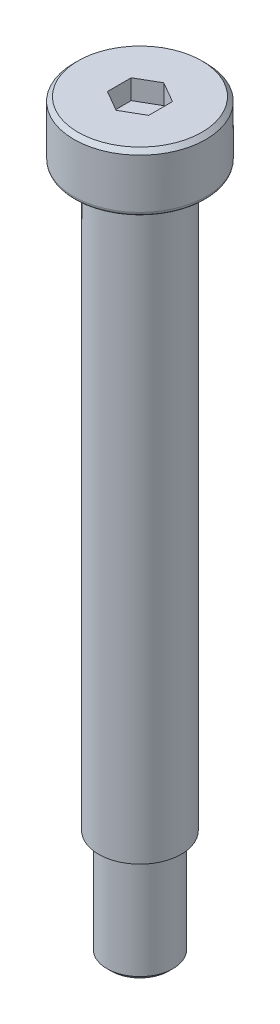
ISO-10303-21;
HEADER;
FILE_DESCRIPTION(('STEP AP214'),'2;1');
FILE_NAME('part.step','',(''),(''),'','','');
FILE_SCHEMA(('AUTOMOTIVE_DESIGN { 1 0 10303 214 1 1 1 1 }'));
ENDSEC;
DATA;
#1=APPLICATION_CONTEXT('core data for automotive mechanical design processes');
#2=APPLICATION_PROTOCOL_DEFINITION('international standard','automotive_design',2000,#1);
#3=PRODUCT_CONTEXT('',#1,'mechanical');
#4=PRODUCT('Part','Part','',(#3));
#5=PRODUCT_RELATED_PRODUCT_CATEGORY('part','',(#4));
#6=PRODUCT_DEFINITION_FORMATION('','',#4);
#7=PRODUCT_DEFINITION_CONTEXT('part definition',#1,'design');
#8=PRODUCT_DEFINITION('design','',#6,#7);
#9=PRODUCT_DEFINITION_SHAPE('','',#8);
#10=(LENGTH_UNIT() NAMED_UNIT(*) SI_UNIT(.MILLI.,.METRE.));
#11=(NAMED_UNIT(*) PLANE_ANGLE_UNIT() SI_UNIT($,.RADIAN.));
#12=(NAMED_UNIT(*) SI_UNIT($,.STERADIAN.) SOLID_ANGLE_UNIT());
#13=UNCERTAINTY_MEASURE_WITH_UNIT(LENGTH_MEASURE(1.E-05),#10,'distance_accuracy_value','');
#14=(GEOMETRIC_REPRESENTATION_CONTEXT(3) GLOBAL_UNCERTAINTY_ASSIGNED_CONTEXT((#13)) GLOBAL_UNIT_ASSIGNED_CONTEXT((#10,
#11,#12)) REPRESENTATION_CONTEXT('',''));
#15=CARTESIAN_POINT('',(0.,0.,0.));
#16=DIRECTION('',(0.,0.,1.));
#17=DIRECTION('',(1.,0.,0.));
#18=AXIS2_PLACEMENT_3D('',#15,#16,#17);
#19=CARTESIAN_POINT('',(0.,0.,0.));
#20=DIRECTION('',(0.,-1.,0.));
#21=DIRECTION('',(1.,0.,0.));
#22=AXIS2_PLACEMENT_3D('',#19,#20,#21);
#23=PLANE('',#22);
#24=CARTESIAN_POINT('',(0.,0.,0.));
#25=DIRECTION('',(0.,-1.,0.));
#26=DIRECTION('',(1.,0.,0.));
#27=AXIS2_PLACEMENT_3D('',#24,#25,#26);
#28=CIRCLE('',#27,7.49999999999998);
#29=CARTESIAN_POINT('',(7.49999999999998,0.,0.));
#30=VERTEX_POINT('',#29);
#31=EDGE_CURVE('E166',#30,#30,#28,.F.);
#32=ORIENTED_EDGE('',*,*,#31,.T.);
#33=EDGE_LOOP('',(#32));
#34=FACE_BOUND('',#33,.T.);
#35=DIRECTION('',(0.866025403784439,0.,-0.5));
#36=VECTOR('',#35,1.);
#37=CARTESIAN_POINT('',(0.,0.,2.88675134594813));
#38=LINE('',#37,#36);
#39=CARTESIAN_POINT('',(0.,0.,2.88675134594813));
#40=VERTEX_POINT('',#39);
#41=CARTESIAN_POINT('',(2.5,0.,1.44337567297407));
#42=VERTEX_POINT('',#41);
#43=EDGE_CURVE('E133',#40,#42,#38,.T.);
#44=ORIENTED_EDGE('',*,*,#43,.F.);
#45=DIRECTION('',(0.866025403784439,0.,0.5));
#46=VECTOR('',#45,1.);
#47=CARTESIAN_POINT('',(-2.5,0.,1.44337567297406));
#48=LINE('',#47,#46);
#49=CARTESIAN_POINT('',(-2.5,0.,1.44337567297406));
#50=VERTEX_POINT('',#49);
#51=EDGE_CURVE('E59',#50,#40,#48,.T.);
#52=ORIENTED_EDGE('',*,*,#51,.F.);
#53=DIRECTION('',(0.,0.,1.));
#54=VECTOR('',#53,1.);
#55=CARTESIAN_POINT('',(-2.5,0.,-1.44337567297407));
#56=LINE('',#55,#54);
#57=CARTESIAN_POINT('',(-2.5,0.,-1.44337567297407));
#58=VERTEX_POINT('',#57);
#59=EDGE_CURVE('E142',#58,#50,#56,.T.);
#60=ORIENTED_EDGE('',*,*,#59,.F.);
#61=DIRECTION('',(-0.866025403784439,0.,0.5));
#62=VECTOR('',#61,1.);
#63=CARTESIAN_POINT('',(0.,0.,-2.88675134594813));
#64=LINE('',#63,#62);
#65=CARTESIAN_POINT('',(0.,0.,-2.88675134594813));
#66=VERTEX_POINT('',#65);
#67=EDGE_CURVE('E140',#66,#58,#64,.T.);
#68=ORIENTED_EDGE('',*,*,#67,.F.);
#69=DIRECTION('',(-0.866025403784439,0.,-0.5));
#70=VECTOR('',#69,1.);
#71=CARTESIAN_POINT('',(2.5,0.,-1.44337567297407));
#72=LINE('',#71,#70);
#73=CARTESIAN_POINT('',(2.5,0.,-1.44337567297407));
#74=VERTEX_POINT('',#73);
#75=EDGE_CURVE('E107',#74,#66,#72,.T.);
#76=ORIENTED_EDGE('',*,*,#75,.F.);
#77=DIRECTION('',(0.,0.,-1.));
#78=VECTOR('',#77,1.);
#79=CARTESIAN_POINT('',(2.5,0.,1.44337567297407));
#80=LINE('',#79,#78);
#81=EDGE_CURVE('E136',#42,#74,#80,.T.);
#82=ORIENTED_EDGE('',*,*,#81,.F.);
#83=EDGE_LOOP('',(#44,#52,#60,#68,#76,#82));
#84=FACE_BOUND('',#83,.T.);
#85=ADVANCED_FACE('F43',(#34,#84),#23,.F.);
#86=CARTESIAN_POINT('',(0.,5.,0.));
#87=DIRECTION('',(0.,1.,0.));
#88=DIRECTION('',(-1.,0.,0.));
#89=AXIS2_PLACEMENT_3D('',#86,#87,#88);
#90=CYLINDRICAL_SURFACE('',#89,8.);
#91=CARTESIAN_POINT('',(0.,-6.50000000000001,0.));
#92=DIRECTION('',(0.,1.,0.));
#93=DIRECTION('',(-1.,0.,0.));
#94=AXIS2_PLACEMENT_3D('',#91,#92,#93);
#95=CIRCLE('',#94,8.);
#96=CARTESIAN_POINT('',(-8.,-6.50000000000001,0.));
#97=VERTEX_POINT('',#96);
#98=EDGE_CURVE('E172',#97,#97,#95,.T.);
#99=ORIENTED_EDGE('',*,*,#98,.T.);
#100=EDGE_LOOP('',(#99));
#101=FACE_BOUND('',#100,.T.);
#102=CARTESIAN_POINT('',(0.,-0.500000000000012,0.));
#103=DIRECTION('',(0.,-1.,0.));
#104=DIRECTION('',(1.,0.,0.));
#105=AXIS2_PLACEMENT_3D('',#102,#103,#104);
#106=CIRCLE('',#105,8.);
#107=CARTESIAN_POINT('',(8.,-0.500000000000011,0.));
#108=VERTEX_POINT('',#107);
#109=EDGE_CURVE('E169',#108,#108,#106,.T.);
#110=ORIENTED_EDGE('',*,*,#109,.T.);
#111=EDGE_LOOP('',(#110));
#112=FACE_BOUND('',#111,.T.);
#113=ADVANCED_FACE('F194',(#101,#112),#90,.T.);
#114=CARTESIAN_POINT('',(8.00000000000001,-7.,0.));
#115=DIRECTION('',(0.,1.,0.));
#116=DIRECTION('',(-1.,0.,0.));
#117=AXIS2_PLACEMENT_3D('',#114,#115,#116);
#118=PLANE('',#117);
#119=CARTESIAN_POINT('',(0.,-7.,0.));
#120=DIRECTION('',(0.,1.,0.));
#121=DIRECTION('',(-1.,0.,0.));
#122=AXIS2_PLACEMENT_3D('',#119,#120,#121);
#123=CIRCLE('',#122,7.5);
#124=CARTESIAN_POINT('',(-7.5,-7.00000000000001,0.));
#125=VERTEX_POINT('',#124);
#126=EDGE_CURVE('E175',#125,#125,#123,.F.);
#127=ORIENTED_EDGE('',*,*,#126,.T.);
#128=EDGE_LOOP('',(#127));
#129=FACE_BOUND('',#128,.T.);
#130=CARTESIAN_POINT('',(0.,-7.00000000000001,0.));
#131=DIRECTION('',(0.,1.,0.));
#132=DIRECTION('',(-1.,0.,0.));
#133=AXIS2_PLACEMENT_3D('',#130,#131,#132);
#134=CIRCLE('',#133,4.75);
#135=CARTESIAN_POINT('',(-4.75,-7.00000000000001,0.));
#136=VERTEX_POINT('',#135);
#137=EDGE_CURVE('E163',#136,#136,#134,.T.);
#138=ORIENTED_EDGE('',*,*,#137,.T.);
#139=EDGE_LOOP('',(#138));
#140=FACE_BOUND('',#139,.T.);
#141=ADVANCED_FACE('F202',(#129,#140),#118,.F.);
#142=CARTESIAN_POINT('',(0.,5.,0.));
#143=DIRECTION('',(0.,1.,0.));
#144=DIRECTION('',(-1.,0.,0.));
#145=AXIS2_PLACEMENT_3D('',#142,#143,#144);
#146=CYLINDRICAL_SURFACE('',#145,4.75);
#147=ORIENTED_EDGE('',*,*,#137,.F.);
#148=EDGE_LOOP('',(#147));
#149=FACE_BOUND('',#148,.T.);
#150=CARTESIAN_POINT('',(0.,-7.50000000000001,0.));
#151=DIRECTION('',(0.,1.,0.));
#152=DIRECTION('',(-1.,0.,0.));
#153=AXIS2_PLACEMENT_3D('',#150,#151,#152);
#154=CIRCLE('',#153,4.75);
#155=CARTESIAN_POINT('',(-4.75,-7.50000000000001,0.));
#156=VERTEX_POINT('',#155);
#157=EDGE_CURVE('E160',#156,#156,#154,.T.);
#158=ORIENTED_EDGE('',*,*,#157,.T.);
#159=EDGE_LOOP('',(#158));
#160=FACE_BOUND('',#159,.T.);
#161=ADVANCED_FACE('F256',(#149,#160),#146,.T.);
#162=CARTESIAN_POINT('',(4.75,-7.50000000000001,0.));
#163=DIRECTION('',(0.,-1.,0.));
#164=DIRECTION('',(1.,0.,0.));
#165=AXIS2_PLACEMENT_3D('',#162,#163,#164);
#166=PLANE('',#165);
#167=ORIENTED_EDGE('',*,*,#157,.F.);
#168=EDGE_LOOP('',(#167));
#169=FACE_BOUND('',#168,.T.);
#170=CARTESIAN_POINT('',(0.,-7.50000000000001,0.));
#171=DIRECTION('',(0.,1.,0.));
#172=DIRECTION('',(-1.,0.,0.));
#173=AXIS2_PLACEMENT_3D('',#170,#171,#172);
#174=CIRCLE('',#173,5.);
#175=CARTESIAN_POINT('',(-5.,-7.50000000000001,0.));
#176=VERTEX_POINT('',#175);
#177=EDGE_CURVE('E157',#176,#176,#174,.T.);
#178=ORIENTED_EDGE('',*,*,#177,.T.);
#179=EDGE_LOOP('',(#178));
#180=FACE_BOUND('',#179,.T.);
#181=ADVANCED_FACE('F252',(#169,#180),#166,.F.);
#182=CARTESIAN_POINT('',(0.,5.,0.));
#183=DIRECTION('',(0.,1.,0.));
#184=DIRECTION('',(-1.,0.,0.));
#185=AXIS2_PLACEMENT_3D('',#182,#183,#184);
#186=CYLINDRICAL_SURFACE('',#185,5.00000000000001);
#187=ORIENTED_EDGE('',*,*,#177,.F.);
#188=EDGE_LOOP('',(#187));
#189=FACE_BOUND('',#188,.T.);
#190=CARTESIAN_POINT('',(0.,-77.,0.));
#191=DIRECTION('',(0.,1.,0.));
#192=DIRECTION('',(-1.,0.,0.));
#193=AXIS2_PLACEMENT_3D('',#190,#191,#192);
#194=CIRCLE('',#193,5.00000000000002);
#195=CARTESIAN_POINT('',(-5.,-77.,0.));
#196=VERTEX_POINT('',#195);
#197=EDGE_CURVE('E154',#196,#196,#194,.T.);
#198=ORIENTED_EDGE('',*,*,#197,.T.);
#199=EDGE_LOOP('',(#198));
#200=FACE_BOUND('',#199,.T.);
#201=ADVANCED_FACE('F248',(#189,#200),#186,.T.);
#202=CARTESIAN_POINT('',(5.00000000000002,-77.,0.));
#203=DIRECTION('',(0.,1.,0.));
#204=DIRECTION('',(-1.,0.,0.));
#205=AXIS2_PLACEMENT_3D('',#202,#203,#204);
#206=PLANE('',#205);
#207=ORIENTED_EDGE('',*,*,#197,.F.);
#208=EDGE_LOOP('',(#207));
#209=FACE_BOUND('',#208,.T.);
#210=CARTESIAN_POINT('',(0.,-77.,0.));
#211=DIRECTION('',(0.,1.,0.));
#212=DIRECTION('',(-1.,0.,0.));
#213=AXIS2_PLACEMENT_3D('',#210,#211,#212);
#214=CIRCLE('',#213,4.);
#215=CARTESIAN_POINT('',(-3.99999999999999,-77.,0.));
#216=VERTEX_POINT('',#215);
#217=EDGE_CURVE('E146',#216,#216,#214,.T.);
#218=ORIENTED_EDGE('',*,*,#217,.T.);
#219=EDGE_LOOP('',(#218));
#220=FACE_BOUND('',#219,.T.);
#221=ADVANCED_FACE('F245',(#209,#220),#206,.F.);
#222=CARTESIAN_POINT('',(0.,5.,0.));
#223=DIRECTION('',(0.,1.,0.));
#224=DIRECTION('',(-1.,0.,0.));
#225=AXIS2_PLACEMENT_3D('',#222,#223,#224);
#226=CYLINDRICAL_SURFACE('',#225,4.);
#227=CARTESIAN_POINT('',(0.,-89.5,0.));
#228=DIRECTION('',(0.,1.,0.));
#229=DIRECTION('',(-1.,0.,0.));
#230=AXIS2_PLACEMENT_3D('',#227,#228,#229);
#231=CIRCLE('',#230,4.);
#232=CARTESIAN_POINT('',(-3.99999999999999,-89.5,0.));
#233=VERTEX_POINT('',#232);
#234=EDGE_CURVE('E52',#233,#233,#231,.T.);
#235=ORIENTED_EDGE('',*,*,#234,.T.);
#236=EDGE_LOOP('',(#235));
#237=FACE_BOUND('',#236,.T.);
#238=ORIENTED_EDGE('',*,*,#217,.F.);
#239=EDGE_LOOP('',(#238));
#240=FACE_BOUND('',#239,.T.);
#241=ADVANCED_FACE('F180',(#237,#240),#226,.T.);
#242=CARTESIAN_POINT('',(4.00000000000001,-90.,0.));
#243=DIRECTION('',(0.,1.,0.));
#244=DIRECTION('',(-1.,0.,0.));
#245=AXIS2_PLACEMENT_3D('',#242,#243,#244);
#246=PLANE('',#245);
#247=CARTESIAN_POINT('',(0.,-90.,0.));
#248=DIRECTION('',(0.,1.,0.));
#249=DIRECTION('',(-1.,0.,0.));
#250=AXIS2_PLACEMENT_3D('',#247,#248,#249);
#251=CIRCLE('',#250,3.49999999999997);
#252=CARTESIAN_POINT('',(-3.49999999999996,-90.,0.));
#253=VERTEX_POINT('',#252);
#254=EDGE_CURVE('E11',#253,#253,#251,.F.);
#255=ORIENTED_EDGE('',*,*,#254,.T.);
#256=EDGE_LOOP('',(#255));
#257=FACE_BOUND('',#256,.T.);
#258=ADVANCED_FACE('F240',(#257),#246,.F.);
#259=CARTESIAN_POINT('',(-2.5,-2.4,1.44337567297406));
#260=DIRECTION('',(-0.5,0.,0.866025403784439));
#261=DIRECTION('',(0.866025403784439,0.,0.5));
#262=AXIS2_PLACEMENT_3D('',#259,#260,#261);
#263=PLANE('',#262);
#264=ORIENTED_EDGE('',*,*,#51,.T.);
#265=DIRECTION('',(0.,1.,0.));
#266=VECTOR('',#265,1.);
#267=CARTESIAN_POINT('',(0.,-2.4,2.88675134594813));
#268=LINE('',#267,#266);
#269=CARTESIAN_POINT('',(0.,-2.4,2.88675134594813));
#270=VERTEX_POINT('',#269);
#271=EDGE_CURVE('E89',#270,#40,#268,.T.);
#272=ORIENTED_EDGE('',*,*,#271,.F.);
#273=DIRECTION('',(0.866025403784439,0.,0.5));
#274=VECTOR('',#273,1.);
#275=CARTESIAN_POINT('',(-2.5,-2.4,1.44337567297406));
#276=LINE('',#275,#274);
#277=CARTESIAN_POINT('',(-2.5,-2.4,1.44337567297406));
#278=VERTEX_POINT('',#277);
#279=EDGE_CURVE('E144',#278,#270,#276,.T.);
#280=ORIENTED_EDGE('',*,*,#279,.F.);
#281=DIRECTION('',(0.,1.,0.));
#282=VECTOR('',#281,1.);
#283=CARTESIAN_POINT('',(-2.5,-2.4,1.44337567297406));
#284=LINE('',#283,#282);
#285=EDGE_CURVE('E67',#278,#50,#284,.T.);
#286=ORIENTED_EDGE('',*,*,#285,.T.);
#287=EDGE_LOOP('',(#264,#272,#280,#286));
#288=FACE_BOUND('',#287,.T.);
#289=ADVANCED_FACE('F230',(#288),#263,.F.);
#290=CARTESIAN_POINT('',(-2.5,-2.4,-1.44337567297407));
#291=DIRECTION('',(-1.,0.,0.));
#292=DIRECTION('',(0.,-1.,0.));
#293=AXIS2_PLACEMENT_3D('',#290,#291,#292);
#294=PLANE('',#293);
#295=ORIENTED_EDGE('',*,*,#59,.T.);
#296=ORIENTED_EDGE('',*,*,#285,.F.);
#297=DIRECTION('',(0.,0.,1.));
#298=VECTOR('',#297,1.);
#299=CARTESIAN_POINT('',(-2.5,-2.4,-1.44337567297407));
#300=LINE('',#299,#298);
#301=CARTESIAN_POINT('',(-2.5,-2.4,-1.44337567297407));
#302=VERTEX_POINT('',#301);
#303=EDGE_CURVE('E119',#302,#278,#300,.T.);
#304=ORIENTED_EDGE('',*,*,#303,.F.);
#305=DIRECTION('',(0.,1.,0.));
#306=VECTOR('',#305,1.);
#307=CARTESIAN_POINT('',(-2.5,-2.4,-1.44337567297407));
#308=LINE('',#307,#306);
#309=EDGE_CURVE('E111',#302,#58,#308,.T.);
#310=ORIENTED_EDGE('',*,*,#309,.T.);
#311=EDGE_LOOP('',(#295,#296,#304,#310));
#312=FACE_BOUND('',#311,.T.);
#313=ADVANCED_FACE('F227',(#312),#294,.F.);
#314=CARTESIAN_POINT('',(0.,-2.4,-2.88675134594813));
#315=DIRECTION('',(-0.5,0.,-0.866025403784439));
#316=DIRECTION('',(-0.866025403784439,0.,0.5));
#317=AXIS2_PLACEMENT_3D('',#314,#315,#316);
#318=PLANE('',#317);
#319=ORIENTED_EDGE('',*,*,#67,.T.);
#320=ORIENTED_EDGE('',*,*,#309,.F.);
#321=DIRECTION('',(-0.866025403784439,0.,0.5));
#322=VECTOR('',#321,1.);
#323=CARTESIAN_POINT('',(0.,-2.4,-2.88675134594813));
#324=LINE('',#323,#322);
#325=CARTESIAN_POINT('',(0.,-2.4,-2.88675134594813));
#326=VERTEX_POINT('',#325);
#327=EDGE_CURVE('E115',#326,#302,#324,.T.);
#328=ORIENTED_EDGE('',*,*,#327,.F.);
#329=DIRECTION('',(0.,1.,0.));
#330=VECTOR('',#329,1.);
#331=CARTESIAN_POINT('',(0.,-2.4,-2.88675134594813));
#332=LINE('',#331,#330);
#333=EDGE_CURVE('E100',#326,#66,#332,.T.);
#334=ORIENTED_EDGE('',*,*,#333,.T.);
#335=EDGE_LOOP('',(#319,#320,#328,#334));
#336=FACE_BOUND('',#335,.T.);
#337=ADVANCED_FACE('F116',(#336),#318,.F.);
#338=CARTESIAN_POINT('',(2.5,-2.4,-1.44337567297407));
#339=DIRECTION('',(0.5,0.,-0.866025403784439));
#340=DIRECTION('',(-0.866025403784439,0.,-0.5));
#341=AXIS2_PLACEMENT_3D('',#338,#339,#340);
#342=PLANE('',#341);
#343=ORIENTED_EDGE('',*,*,#75,.T.);
#344=ORIENTED_EDGE('',*,*,#333,.F.);
#345=DIRECTION('',(-0.866025403784439,0.,-0.5));
#346=VECTOR('',#345,1.);
#347=CARTESIAN_POINT('',(2.5,-2.4,-1.44337567297407));
#348=LINE('',#347,#346);
#349=CARTESIAN_POINT('',(2.5,-2.4,-1.44337567297407));
#350=VERTEX_POINT('',#349);
#351=EDGE_CURVE('E104',#350,#326,#348,.T.);
#352=ORIENTED_EDGE('',*,*,#351,.F.);
#353=DIRECTION('',(0.,1.,0.));
#354=VECTOR('',#353,1.);
#355=CARTESIAN_POINT('',(2.5,-2.4,-1.44337567297407));
#356=LINE('',#355,#354);
#357=EDGE_CURVE('E112',#350,#74,#356,.T.);
#358=ORIENTED_EDGE('',*,*,#357,.T.);
#359=EDGE_LOOP('',(#343,#344,#352,#358));
#360=FACE_BOUND('',#359,.T.);
#361=ADVANCED_FACE('F102',(#360),#342,.F.);
#362=CARTESIAN_POINT('',(2.5,-2.4,1.44337567297407));
#363=DIRECTION('',(1.,0.,0.));
#364=DIRECTION('',(0.,0.,-1.));
#365=AXIS2_PLACEMENT_3D('',#362,#363,#364);
#366=PLANE('',#365);
#367=ORIENTED_EDGE('',*,*,#81,.T.);
#368=ORIENTED_EDGE('',*,*,#357,.F.);
#369=DIRECTION('',(0.,0.,-1.));
#370=VECTOR('',#369,1.);
#371=CARTESIAN_POINT('',(2.5,-2.4,1.44337567297407));
#372=LINE('',#371,#370);
#373=CARTESIAN_POINT('',(2.5,-2.4,1.44337567297407));
#374=VERTEX_POINT('',#373);
#375=EDGE_CURVE('E125',#374,#350,#372,.T.);
#376=ORIENTED_EDGE('',*,*,#375,.F.);
#377=DIRECTION('',(0.,1.,0.));
#378=VECTOR('',#377,1.);
#379=CARTESIAN_POINT('',(2.5,-2.4,1.44337567297407));
#380=LINE('',#379,#378);
#381=EDGE_CURVE('E149',#374,#42,#380,.T.);
#382=ORIENTED_EDGE('',*,*,#381,.T.);
#383=EDGE_LOOP('',(#367,#368,#376,#382));
#384=FACE_BOUND('',#383,.T.);
#385=ADVANCED_FACE('F223',(#384),#366,.F.);
#386=CARTESIAN_POINT('',(0.,-2.4,2.88675134594813));
#387=DIRECTION('',(0.5,0.,0.866025403784439));
#388=DIRECTION('',(0.866025403784439,0.,-0.5));
#389=AXIS2_PLACEMENT_3D('',#386,#387,#388);
#390=PLANE('',#389);
#391=ORIENTED_EDGE('',*,*,#43,.T.);
#392=ORIENTED_EDGE('',*,*,#381,.F.);
#393=DIRECTION('',(0.866025403784439,0.,-0.5));
#394=VECTOR('',#393,1.);
#395=CARTESIAN_POINT('',(0.,-2.4,2.88675134594813));
#396=LINE('',#395,#394);
#397=EDGE_CURVE('E127',#270,#374,#396,.T.);
#398=ORIENTED_EDGE('',*,*,#397,.F.);
#399=ORIENTED_EDGE('',*,*,#271,.T.);
#400=EDGE_LOOP('',(#391,#392,#398,#399));
#401=FACE_BOUND('',#400,.T.);
#402=ADVANCED_FACE('F214',(#401),#390,.F.);
#403=CARTESIAN_POINT('',(0.,-2.4,0.));
#404=DIRECTION('',(0.,1.,0.));
#405=DIRECTION('',(-1.,0.,0.));
#406=AXIS2_PLACEMENT_3D('',#403,#404,#405);
#407=PLANE('',#406);
#408=ORIENTED_EDGE('',*,*,#279,.T.);
#409=ORIENTED_EDGE('',*,*,#397,.T.);
#410=ORIENTED_EDGE('',*,*,#375,.T.);
#411=ORIENTED_EDGE('',*,*,#351,.T.);
#412=ORIENTED_EDGE('',*,*,#327,.T.);
#413=ORIENTED_EDGE('',*,*,#303,.T.);
#414=EDGE_LOOP('',(#408,#409,#410,#411,#412,#413));
#415=FACE_BOUND('',#414,.T.);
#416=ADVANCED_FACE('F122',(#415),#407,.T.);
#417=CARTESIAN_POINT('',(0.,0.,0.));
#418=DIRECTION('',(0.,-1.,0.));
#419=DIRECTION('',(1.,0.,0.));
#420=AXIS2_PLACEMENT_3D('',#417,#418,#419);
#421=CONICAL_SURFACE('',#420,7.49999999999998,0.785398163397462);
#422=ORIENTED_EDGE('',*,*,#109,.F.);
#423=EDGE_LOOP('',(#422));
#424=FACE_BOUND('',#423,.T.);
#425=ORIENTED_EDGE('',*,*,#31,.F.);
#426=EDGE_LOOP('',(#425));
#427=FACE_BOUND('',#426,.T.);
#428=ADVANCED_FACE('F190',(#424,#427),#421,.T.);
#429=CARTESIAN_POINT('',(0.,-6.50000000000001,0.));
#430=DIRECTION('',(0.,1.,0.));
#431=DIRECTION('',(-1.,0.,0.));
#432=AXIS2_PLACEMENT_3D('',#429,#430,#431);
#433=TOROIDAL_SURFACE('',#432,7.5,0.5);
#434=ORIENTED_EDGE('',*,*,#126,.F.);
#435=EDGE_LOOP('',(#434));
#436=FACE_BOUND('',#435,.T.);
#437=ORIENTED_EDGE('',*,*,#98,.F.);
#438=EDGE_LOOP('',(#437));
#439=FACE_BOUND('',#438,.T.);
#440=ADVANCED_FACE('F184',(#436,#439),#433,.T.);
#441=CARTESIAN_POINT('',(0.,-89.5,0.));
#442=DIRECTION('',(0.,1.,0.));
#443=DIRECTION('',(-1.,0.,0.));
#444=AXIS2_PLACEMENT_3D('',#441,#442,#443);
#445=CONICAL_SURFACE('',#444,4.,0.785398163397439);
#446=ORIENTED_EDGE('',*,*,#254,.F.);
#447=EDGE_LOOP('',(#446));
#448=FACE_BOUND('',#447,.T.);
#449=ORIENTED_EDGE('',*,*,#234,.F.);
#450=EDGE_LOOP('',(#449));
#451=FACE_BOUND('',#450,.T.);
#452=ADVANCED_FACE('F46',(#448,#451),#445,.T.);
#453=CLOSED_SHELL('',(#85,#113,#141,#161,#181,#201,#221,#241,#258,#289,#313,#337,#361,#385,#402,
#416,#428,#440,#452));
#454=MANIFOLD_SOLID_BREP('B2',#453);
#455=ADVANCED_BREP_SHAPE_REPRESENTATION('',(#18,#454),#14);
#456=SHAPE_DEFINITION_REPRESENTATION(#9,#455);
ENDSEC;
END-ISO-10303-21;
